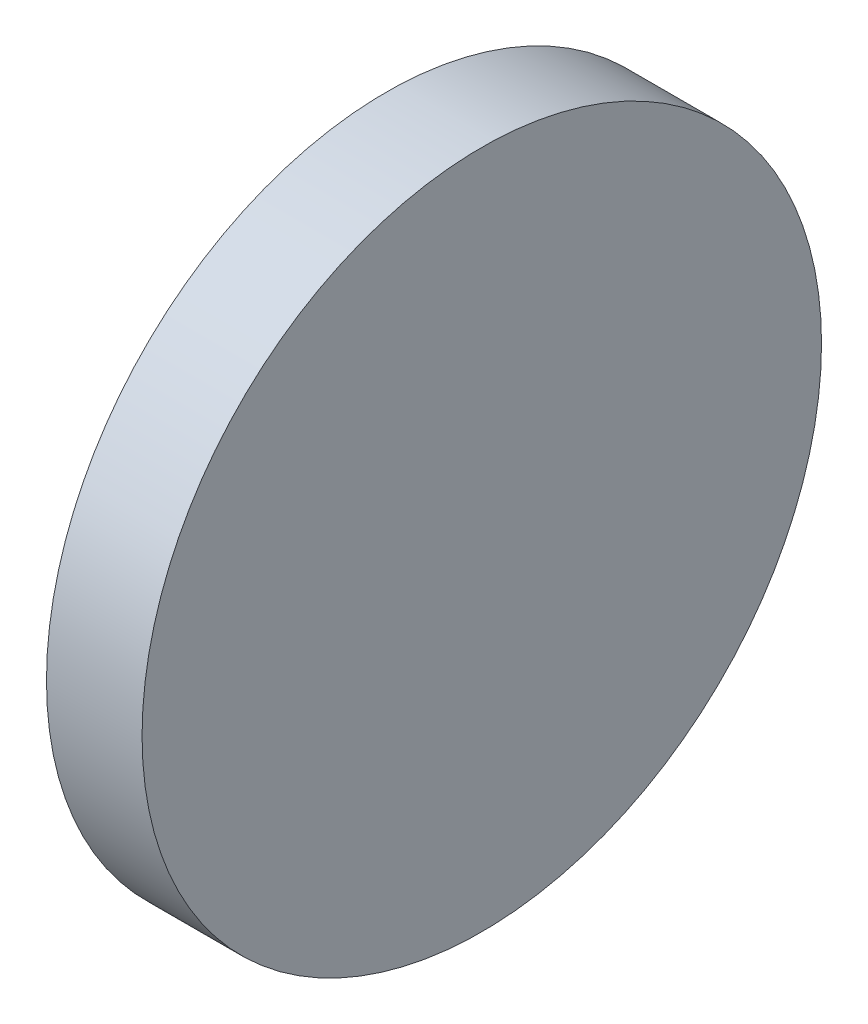
ISO-10303-21;
HEADER;
FILE_DESCRIPTION(('STEP AP214'),'2;1');
FILE_NAME('part.step','',(''),(''),'','','');
FILE_SCHEMA(('AUTOMOTIVE_DESIGN { 1 0 10303 214 1 1 1 1 }'));
ENDSEC;
DATA;
#1=APPLICATION_CONTEXT('core data for automotive mechanical design processes');
#2=APPLICATION_PROTOCOL_DEFINITION('international standard','automotive_design',2000,#1);
#3=PRODUCT_CONTEXT('',#1,'mechanical');
#4=PRODUCT('Part','Part','',(#3));
#5=PRODUCT_RELATED_PRODUCT_CATEGORY('part','',(#4));
#6=PRODUCT_DEFINITION_FORMATION('','',#4);
#7=PRODUCT_DEFINITION_CONTEXT('part definition',#1,'design');
#8=PRODUCT_DEFINITION('design','',#6,#7);
#9=PRODUCT_DEFINITION_SHAPE('','',#8);
#10=(LENGTH_UNIT() NAMED_UNIT(*) SI_UNIT(.MILLI.,.METRE.));
#11=(NAMED_UNIT(*) PLANE_ANGLE_UNIT() SI_UNIT($,.RADIAN.));
#12=(NAMED_UNIT(*) SI_UNIT($,.STERADIAN.) SOLID_ANGLE_UNIT());
#13=UNCERTAINTY_MEASURE_WITH_UNIT(LENGTH_MEASURE(1.E-05),#10,'distance_accuracy_value','');
#14=(GEOMETRIC_REPRESENTATION_CONTEXT(3) GLOBAL_UNCERTAINTY_ASSIGNED_CONTEXT((#13)) GLOBAL_UNIT_ASSIGNED_CONTEXT((#10,
#11,#12)) REPRESENTATION_CONTEXT('',''));
#15=CARTESIAN_POINT('',(0.,0.,0.));
#16=DIRECTION('',(0.,0.,1.));
#17=DIRECTION('',(1.,0.,0.));
#18=AXIS2_PLACEMENT_3D('',#15,#16,#17);
#19=CARTESIAN_POINT('',(-1.055,0.,0.));
#20=DIRECTION('',(1.,0.,0.));
#21=DIRECTION('',(0.,0.,-1.));
#22=AXIS2_PLACEMENT_3D('',#19,#20,#21);
#23=PLANE('',#22);
#24=CARTESIAN_POINT('',(-1.055,0.,0.));
#25=DIRECTION('',(-1.,0.,0.));
#26=DIRECTION('',(0.,0.,1.));
#27=AXIS2_PLACEMENT_3D('',#24,#25,#26);
#28=CIRCLE('',#27,7.5);
#29=CARTESIAN_POINT('',(-1.055,0.,7.5));
#30=VERTEX_POINT('',#29);
#31=EDGE_CURVE('E10',#30,#30,#28,.T.);
#32=ORIENTED_EDGE('',*,*,#31,.T.);
#33=EDGE_LOOP('',(#32));
#34=FACE_BOUND('',#33,.T.);
#35=ADVANCED_FACE('F37',(#34),#23,.F.);
#36=CARTESIAN_POINT('',(-1.055,0.,0.));
#37=DIRECTION('',(-1.,0.,0.));
#38=DIRECTION('',(0.,0.,1.));
#39=AXIS2_PLACEMENT_3D('',#36,#37,#38);
#40=CYLINDRICAL_SURFACE('',#39,7.5);
#41=ORIENTED_EDGE('',*,*,#31,.F.);
#42=EDGE_LOOP('',(#41));
#43=FACE_BOUND('',#42,.T.);
#44=CARTESIAN_POINT('',(1.055,0.,0.));
#45=DIRECTION('',(-1.,0.,0.));
#46=DIRECTION('',(0.,0.,1.));
#47=AXIS2_PLACEMENT_3D('',#44,#45,#46);
#48=CIRCLE('',#47,7.5);
#49=CARTESIAN_POINT('',(1.055,0.,7.5));
#50=VERTEX_POINT('',#49);
#51=EDGE_CURVE('E44',#50,#50,#48,.T.);
#52=ORIENTED_EDGE('',*,*,#51,.T.);
#53=EDGE_LOOP('',(#52));
#54=FACE_BOUND('',#53,.T.);
#55=ADVANCED_FACE('F51',(#43,#54),#40,.T.);
#56=CARTESIAN_POINT('',(1.055,0.,0.));
#57=DIRECTION('',(-1.,0.,0.));
#58=DIRECTION('',(0.,0.,1.));
#59=AXIS2_PLACEMENT_3D('',#56,#57,#58);
#60=PLANE('',#59);
#61=ORIENTED_EDGE('',*,*,#51,.F.);
#62=EDGE_LOOP('',(#61));
#63=FACE_BOUND('',#62,.T.);
#64=ADVANCED_FACE('F53',(#63),#60,.F.);
#65=CLOSED_SHELL('',(#35,#55,#64));
#66=MANIFOLD_SOLID_BREP('B2',#65);
#67=ADVANCED_BREP_SHAPE_REPRESENTATION('',(#18,#66),#14);
#68=SHAPE_DEFINITION_REPRESENTATION(#9,#67);
ENDSEC;
END-ISO-10303-21;
